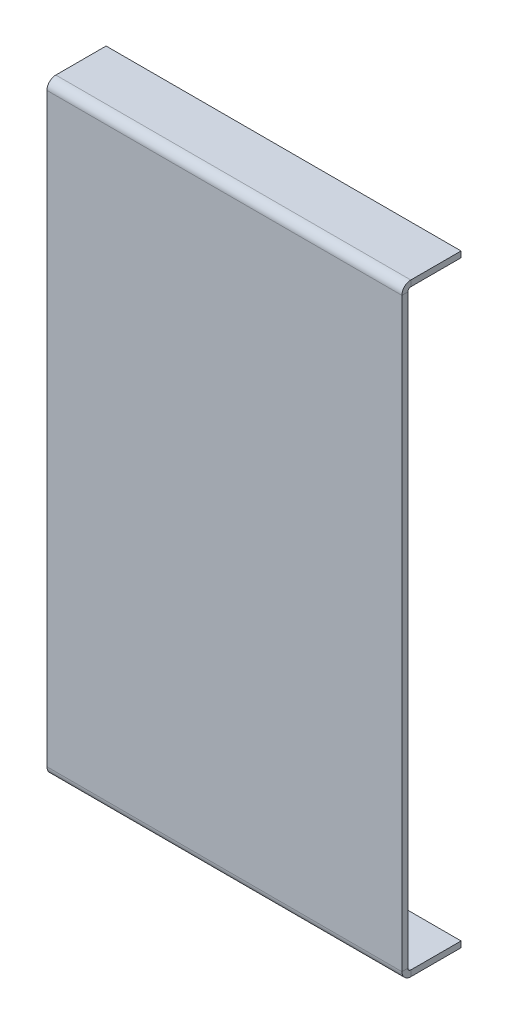
ISO-10303-21;
HEADER;
FILE_DESCRIPTION(('STEP AP214'),'2;1');
FILE_NAME('part.step','',(''),(''),'','','');
FILE_SCHEMA(('AUTOMOTIVE_DESIGN { 1 0 10303 214 1 1 1 1 }'));
ENDSEC;
DATA;
#1=APPLICATION_CONTEXT('core data for automotive mechanical design processes');
#2=APPLICATION_PROTOCOL_DEFINITION('international standard','automotive_design',2000,#1);
#3=PRODUCT_CONTEXT('',#1,'mechanical');
#4=PRODUCT('Part','Part','',(#3));
#5=PRODUCT_RELATED_PRODUCT_CATEGORY('part','',(#4));
#6=PRODUCT_DEFINITION_FORMATION('','',#4);
#7=PRODUCT_DEFINITION_CONTEXT('part definition',#1,'design');
#8=PRODUCT_DEFINITION('design','',#6,#7);
#9=PRODUCT_DEFINITION_SHAPE('','',#8);
#10=(LENGTH_UNIT() NAMED_UNIT(*) SI_UNIT(.MILLI.,.METRE.));
#11=(NAMED_UNIT(*) PLANE_ANGLE_UNIT() SI_UNIT($,.RADIAN.));
#12=(NAMED_UNIT(*) SI_UNIT($,.STERADIAN.) SOLID_ANGLE_UNIT());
#13=UNCERTAINTY_MEASURE_WITH_UNIT(LENGTH_MEASURE(1.E-05),#10,'distance_accuracy_value','');
#14=(GEOMETRIC_REPRESENTATION_CONTEXT(3) GLOBAL_UNCERTAINTY_ASSIGNED_CONTEXT((#13)) GLOBAL_UNIT_ASSIGNED_CONTEXT((#10,
#11,#12)) REPRESENTATION_CONTEXT('',''));
#15=CARTESIAN_POINT('',(0.,0.,0.));
#16=DIRECTION('',(0.,0.,1.));
#17=DIRECTION('',(1.,0.,0.));
#18=AXIS2_PLACEMENT_3D('',#15,#16,#17);
#19=CARTESIAN_POINT('',(0.,0.,-2.));
#20=DIRECTION('',(0.,0.,1.));
#21=DIRECTION('',(1.,0.,0.));
#22=AXIS2_PLACEMENT_3D('',#19,#20,#21);
#23=PLANE('',#22);
#24=DIRECTION('',(-1.,0.,0.));
#25=VECTOR('',#24,1.);
#26=CARTESIAN_POINT('',(-60.,-99.,-2.00000000000001));
#27=LINE('',#26,#25);
#28=CARTESIAN_POINT('',(-60.,-99.,-2.00000000000001));
#29=VERTEX_POINT('',#28);
#30=CARTESIAN_POINT('',(60.,-99.,-2.00000000000001));
#31=VERTEX_POINT('',#30);
#32=EDGE_CURVE('E224',#29,#31,#27,.F.);
#33=ORIENTED_EDGE('',*,*,#32,.F.);
#34=DIRECTION('',(0.,-1.,0.));
#35=VECTOR('',#34,1.);
#36=CARTESIAN_POINT('',(-60.,102.,-2.));
#37=LINE('',#36,#35);
#38=CARTESIAN_POINT('',(-60.,99.,-2.00000000000001));
#39=VERTEX_POINT('',#38);
#40=EDGE_CURVE('E13',#39,#29,#37,.T.);
#41=ORIENTED_EDGE('',*,*,#40,.F.);
#42=DIRECTION('',(1.,0.,0.));
#43=VECTOR('',#42,1.);
#44=CARTESIAN_POINT('',(60.,99.,-2.00000000000001));
#45=LINE('',#44,#43);
#46=CARTESIAN_POINT('',(60.,99.,-2.00000000000001));
#47=VERTEX_POINT('',#46);
#48=EDGE_CURVE('E276',#47,#39,#45,.F.);
#49=ORIENTED_EDGE('',*,*,#48,.F.);
#50=DIRECTION('',(0.,1.,0.));
#51=VECTOR('',#50,1.);
#52=CARTESIAN_POINT('',(60.,102.,-2.));
#53=LINE('',#52,#51);
#54=EDGE_CURVE('E87',#31,#47,#53,.T.);
#55=ORIENTED_EDGE('',*,*,#54,.F.);
#56=EDGE_LOOP('',(#33,#41,#49,#55));
#57=FACE_BOUND('',#56,.T.);
#58=ADVANCED_FACE('F78',(#57),#23,.F.);
#59=CARTESIAN_POINT('',(0.,0.,0.));
#60=DIRECTION('',(0.,0.,1.));
#61=DIRECTION('',(1.,0.,0.));
#62=AXIS2_PLACEMENT_3D('',#59,#60,#61);
#63=PLANE('',#62);
#64=DIRECTION('',(0.,-1.,0.));
#65=VECTOR('',#64,1.);
#66=CARTESIAN_POINT('',(-60.,102.,0.));
#67=LINE('',#66,#65);
#68=CARTESIAN_POINT('',(-60.,99.,0.));
#69=VERTEX_POINT('',#68);
#70=CARTESIAN_POINT('',(-60.,-99.,0.));
#71=VERTEX_POINT('',#70);
#72=EDGE_CURVE('E82',#69,#71,#67,.T.);
#73=ORIENTED_EDGE('',*,*,#72,.T.);
#74=DIRECTION('',(-1.,0.,0.));
#75=VECTOR('',#74,1.);
#76=CARTESIAN_POINT('',(-60.,-99.,0.));
#77=LINE('',#76,#75);
#78=CARTESIAN_POINT('',(60.,-99.,0.));
#79=VERTEX_POINT('',#78);
#80=EDGE_CURVE('E213',#71,#79,#77,.F.);
#81=ORIENTED_EDGE('',*,*,#80,.T.);
#82=DIRECTION('',(0.,1.,0.));
#83=VECTOR('',#82,1.);
#84=CARTESIAN_POINT('',(60.,102.,0.));
#85=LINE('',#84,#83);
#86=CARTESIAN_POINT('',(60.,99.,0.));
#87=VERTEX_POINT('',#86);
#88=EDGE_CURVE('E282',#79,#87,#85,.T.);
#89=ORIENTED_EDGE('',*,*,#88,.T.);
#90=DIRECTION('',(1.,0.,0.));
#91=VECTOR('',#90,1.);
#92=CARTESIAN_POINT('',(60.,99.,0.));
#93=LINE('',#92,#91);
#94=EDGE_CURVE('E265',#87,#69,#93,.F.);
#95=ORIENTED_EDGE('',*,*,#94,.T.);
#96=EDGE_LOOP('',(#73,#81,#89,#95));
#97=FACE_BOUND('',#96,.T.);
#98=ADVANCED_FACE('F291',(#97),#63,.T.);
#99=CARTESIAN_POINT('',(-60.,102.,-2.));
#100=DIRECTION('',(-1.,0.,0.));
#101=DIRECTION('',(0.,-1.,0.));
#102=AXIS2_PLACEMENT_3D('',#99,#100,#101);
#103=PLANE('',#102);
#104=ORIENTED_EDGE('',*,*,#40,.T.);
#105=DIRECTION('',(0.,0.,1.));
#106=VECTOR('',#105,1.);
#107=CARTESIAN_POINT('',(-60.,-99.,-2.00000000000001));
#108=LINE('',#107,#106);
#109=EDGE_CURVE('E218',#29,#71,#108,.T.);
#110=ORIENTED_EDGE('',*,*,#109,.T.);
#111=ORIENTED_EDGE('',*,*,#72,.F.);
#112=DIRECTION('',(0.,0.,1.));
#113=VECTOR('',#112,1.);
#114=CARTESIAN_POINT('',(-60.,99.,-2.00000000000001));
#115=LINE('',#114,#113);
#116=EDGE_CURVE('E280',#39,#69,#115,.T.);
#117=ORIENTED_EDGE('',*,*,#116,.F.);
#118=EDGE_LOOP('',(#104,#110,#111,#117));
#119=FACE_BOUND('',#118,.T.);
#120=ADVANCED_FACE('F294',(#119),#103,.T.);
#121=CARTESIAN_POINT('',(60.,102.,-2.));
#122=DIRECTION('',(1.,0.,0.));
#123=DIRECTION('',(0.,1.,0.));
#124=AXIS2_PLACEMENT_3D('',#121,#122,#123);
#125=PLANE('',#124);
#126=DIRECTION('',(0.,0.,1.));
#127=VECTOR('',#126,1.);
#128=CARTESIAN_POINT('',(60.,-99.,-2.00000000000001));
#129=LINE('',#128,#127);
#130=EDGE_CURVE('E228',#31,#79,#129,.T.);
#131=ORIENTED_EDGE('',*,*,#130,.F.);
#132=ORIENTED_EDGE('',*,*,#54,.T.);
#133=DIRECTION('',(0.,0.,1.));
#134=VECTOR('',#133,1.);
#135=CARTESIAN_POINT('',(60.,99.,-2.00000000000001));
#136=LINE('',#135,#134);
#137=EDGE_CURVE('E270',#47,#87,#136,.T.);
#138=ORIENTED_EDGE('',*,*,#137,.T.);
#139=ORIENTED_EDGE('',*,*,#88,.F.);
#140=EDGE_LOOP('',(#131,#132,#138,#139));
#141=FACE_BOUND('',#140,.T.);
#142=ADVANCED_FACE('F80',(#141),#125,.T.);
#143=CARTESIAN_POINT('',(-60.,99.,-3.00000000000001));
#144=DIRECTION('',(-1.,0.,0.));
#145=DIRECTION('',(0.,0.,1.));
#146=AXIS2_PLACEMENT_3D('',#143,#144,#145);
#147=PLANE('',#146);
#148=DIRECTION('',(0.,1.,0.));
#149=VECTOR('',#148,1.);
#150=CARTESIAN_POINT('',(-60.,102.,-3.));
#151=LINE('',#150,#149);
#152=CARTESIAN_POINT('',(-60.,100.,-3.));
#153=VERTEX_POINT('',#152);
#154=CARTESIAN_POINT('',(-60.,102.,-2.99999999999999));
#155=VERTEX_POINT('',#154);
#156=EDGE_CURVE('E230',#153,#155,#151,.T.);
#157=ORIENTED_EDGE('',*,*,#156,.F.);
#158=CARTESIAN_POINT('',(-60.,99.,-3.00000000000001));
#159=DIRECTION('',(1.,0.,0.));
#160=DIRECTION('',(0.,0.,-1.));
#161=AXIS2_PLACEMENT_3D('',#158,#159,#160);
#162=CIRCLE('',#161,1.);
#163=EDGE_CURVE('E273',#39,#153,#162,.F.);
#164=ORIENTED_EDGE('',*,*,#163,.F.);
#165=ORIENTED_EDGE('',*,*,#116,.T.);
#166=CARTESIAN_POINT('',(-60.,99.,-3.00000000000001));
#167=DIRECTION('',(1.,0.,0.));
#168=DIRECTION('',(0.,0.,-1.));
#169=AXIS2_PLACEMENT_3D('',#166,#167,#168);
#170=CIRCLE('',#169,3.);
#171=EDGE_CURVE('E95',#69,#155,#170,.F.);
#172=ORIENTED_EDGE('',*,*,#171,.T.);
#173=EDGE_LOOP('',(#157,#164,#165,#172));
#174=FACE_BOUND('',#173,.T.);
#175=ADVANCED_FACE('F340',(#174),#147,.T.);
#176=CARTESIAN_POINT('',(60.,99.,-3.00000000000001));
#177=DIRECTION('',(-1.,0.,0.));
#178=DIRECTION('',(0.,0.,1.));
#179=AXIS2_PLACEMENT_3D('',#176,#177,#178);
#180=PLANE('',#179);
#181=CARTESIAN_POINT('',(60.,99.,-3.00000000000001));
#182=DIRECTION('',(1.,0.,0.));
#183=DIRECTION('',(0.,0.,-1.));
#184=AXIS2_PLACEMENT_3D('',#181,#182,#183);
#185=CIRCLE('',#184,1.);
#186=CARTESIAN_POINT('',(60.,100.,-3.));
#187=VERTEX_POINT('',#186);
#188=EDGE_CURVE('E235',#187,#47,#185,.T.);
#189=ORIENTED_EDGE('',*,*,#188,.F.);
#190=DIRECTION('',(0.,1.,0.));
#191=VECTOR('',#190,1.);
#192=CARTESIAN_POINT('',(60.,100.,-3.));
#193=LINE('',#192,#191);
#194=CARTESIAN_POINT('',(60.,102.,-2.99999999999999));
#195=VERTEX_POINT('',#194);
#196=EDGE_CURVE('E258',#187,#195,#193,.T.);
#197=ORIENTED_EDGE('',*,*,#196,.T.);
#198=CARTESIAN_POINT('',(60.,99.,-3.00000000000001));
#199=DIRECTION('',(1.,0.,0.));
#200=DIRECTION('',(0.,0.,-1.));
#201=AXIS2_PLACEMENT_3D('',#198,#199,#200);
#202=CIRCLE('',#201,3.);
#203=EDGE_CURVE('E268',#195,#87,#202,.T.);
#204=ORIENTED_EDGE('',*,*,#203,.T.);
#205=ORIENTED_EDGE('',*,*,#137,.F.);
#206=EDGE_LOOP('',(#189,#197,#204,#205));
#207=FACE_BOUND('',#206,.T.);
#208=ADVANCED_FACE('F334',(#207),#180,.F.);
#209=CARTESIAN_POINT('',(60.,99.,-3.00000000000001));
#210=DIRECTION('',(1.,0.,0.));
#211=DIRECTION('',(0.,1.,0.));
#212=AXIS2_PLACEMENT_3D('',#209,#210,#211);
#213=CYLINDRICAL_SURFACE('',#212,3.);
#214=ORIENTED_EDGE('',*,*,#94,.F.);
#215=ORIENTED_EDGE('',*,*,#203,.F.);
#216=DIRECTION('',(1.,0.,0.));
#217=VECTOR('',#216,1.);
#218=CARTESIAN_POINT('',(0.,102.,-2.99999999999999));
#219=LINE('',#218,#217);
#220=EDGE_CURVE('E255',#155,#195,#219,.T.);
#221=ORIENTED_EDGE('',*,*,#220,.F.);
#222=ORIENTED_EDGE('',*,*,#171,.F.);
#223=EDGE_LOOP('',(#214,#215,#221,#222));
#224=FACE_BOUND('',#223,.T.);
#225=ADVANCED_FACE('F348',(#224),#213,.T.);
#226=CARTESIAN_POINT('',(60.,99.,-3.00000000000001));
#227=DIRECTION('',(1.,0.,0.));
#228=DIRECTION('',(0.,1.,0.));
#229=AXIS2_PLACEMENT_3D('',#226,#227,#228);
#230=CYLINDRICAL_SURFACE('',#229,1.);
#231=ORIENTED_EDGE('',*,*,#48,.T.);
#232=ORIENTED_EDGE('',*,*,#163,.T.);
#233=DIRECTION('',(-1.,0.,0.));
#234=VECTOR('',#233,1.);
#235=CARTESIAN_POINT('',(-60.,100.,-3.));
#236=LINE('',#235,#234);
#237=EDGE_CURVE('E261',#153,#187,#236,.F.);
#238=ORIENTED_EDGE('',*,*,#237,.T.);
#239=ORIENTED_EDGE('',*,*,#188,.T.);
#240=EDGE_LOOP('',(#231,#232,#238,#239));
#241=FACE_BOUND('',#240,.T.);
#242=ADVANCED_FACE('F351',(#241),#230,.F.);
#243=CARTESIAN_POINT('',(60.,102.,-1.99999999999999));
#244=DIRECTION('',(1.,0.,0.));
#245=DIRECTION('',(0.,0.,-1.));
#246=AXIS2_PLACEMENT_3D('',#243,#244,#245);
#247=PLANE('',#246);
#248=DIRECTION('',(0.,0.,1.));
#249=VECTOR('',#248,1.);
#250=CARTESIAN_POINT('',(60.,102.,-1.99999999999999));
#251=LINE('',#250,#249);
#252=CARTESIAN_POINT('',(60.,102.,-20.));
#253=VERTEX_POINT('',#252);
#254=EDGE_CURVE('E239',#253,#195,#251,.T.);
#255=ORIENTED_EDGE('',*,*,#254,.T.);
#256=ORIENTED_EDGE('',*,*,#196,.F.);
#257=DIRECTION('',(0.,0.,-1.));
#258=VECTOR('',#257,1.);
#259=CARTESIAN_POINT('',(60.,100.,4.62592926927148E-13));
#260=LINE('',#259,#258);
#261=CARTESIAN_POINT('',(60.,100.,-20.));
#262=VERTEX_POINT('',#261);
#263=EDGE_CURVE('E247',#262,#187,#260,.F.);
#264=ORIENTED_EDGE('',*,*,#263,.F.);
#265=DIRECTION('',(0.,-1.,0.));
#266=VECTOR('',#265,1.);
#267=CARTESIAN_POINT('',(60.,102.,-20.));
#268=LINE('',#267,#266);
#269=EDGE_CURVE('E233',#253,#262,#268,.T.);
#270=ORIENTED_EDGE('',*,*,#269,.F.);
#271=EDGE_LOOP('',(#255,#256,#264,#270));
#272=FACE_BOUND('',#271,.T.);
#273=ADVANCED_FACE('F354',(#272),#247,.T.);
#274=CARTESIAN_POINT('',(-60.,102.,-20.));
#275=DIRECTION('',(-1.,0.,0.));
#276=DIRECTION('',(0.,0.,1.));
#277=AXIS2_PLACEMENT_3D('',#274,#275,#276);
#278=PLANE('',#277);
#279=DIRECTION('',(0.,0.,1.));
#280=VECTOR('',#279,1.);
#281=CARTESIAN_POINT('',(-60.,100.,3.23815048849004E-13));
#282=LINE('',#281,#280);
#283=CARTESIAN_POINT('',(-60.,100.,-20.));
#284=VERTEX_POINT('',#283);
#285=EDGE_CURVE('E253',#153,#284,#282,.F.);
#286=ORIENTED_EDGE('',*,*,#285,.F.);
#287=ORIENTED_EDGE('',*,*,#156,.T.);
#288=DIRECTION('',(0.,0.,-1.));
#289=VECTOR('',#288,1.);
#290=CARTESIAN_POINT('',(-60.,102.,-20.));
#291=LINE('',#290,#289);
#292=CARTESIAN_POINT('',(-60.,102.,-20.));
#293=VERTEX_POINT('',#292);
#294=EDGE_CURVE('E245',#155,#293,#291,.T.);
#295=ORIENTED_EDGE('',*,*,#294,.T.);
#296=DIRECTION('',(0.,-1.,0.));
#297=VECTOR('',#296,1.);
#298=CARTESIAN_POINT('',(-60.,102.,-20.));
#299=LINE('',#298,#297);
#300=EDGE_CURVE('E236',#293,#284,#299,.T.);
#301=ORIENTED_EDGE('',*,*,#300,.T.);
#302=EDGE_LOOP('',(#286,#287,#295,#301));
#303=FACE_BOUND('',#302,.T.);
#304=ADVANCED_FACE('F358',(#303),#278,.T.);
#305=CARTESIAN_POINT('',(0.,102.,4.00186950565762E-13));
#306=DIRECTION('',(0.,1.,0.));
#307=DIRECTION('',(0.,0.,1.));
#308=AXIS2_PLACEMENT_3D('',#305,#306,#307);
#309=PLANE('',#308);
#310=ORIENTED_EDGE('',*,*,#294,.F.);
#311=ORIENTED_EDGE('',*,*,#220,.T.);
#312=ORIENTED_EDGE('',*,*,#254,.F.);
#313=DIRECTION('',(1.,0.,0.));
#314=VECTOR('',#313,1.);
#315=CARTESIAN_POINT('',(60.,102.,-20.));
#316=LINE('',#315,#314);
#317=EDGE_CURVE('E242',#293,#253,#316,.T.);
#318=ORIENTED_EDGE('',*,*,#317,.F.);
#319=EDGE_LOOP('',(#310,#311,#312,#318));
#320=FACE_BOUND('',#319,.T.);
#321=ADVANCED_FACE('F361',(#320),#309,.T.);
#322=CARTESIAN_POINT('',(0.,100.,3.93203987888076E-13));
#323=DIRECTION('',(0.,1.,0.));
#324=DIRECTION('',(0.,0.,1.));
#325=AXIS2_PLACEMENT_3D('',#322,#323,#324);
#326=PLANE('',#325);
#327=ORIENTED_EDGE('',*,*,#237,.F.);
#328=ORIENTED_EDGE('',*,*,#285,.T.);
#329=DIRECTION('',(-1.,0.,0.));
#330=VECTOR('',#329,1.);
#331=CARTESIAN_POINT('',(0.,100.,-20.));
#332=LINE('',#331,#330);
#333=EDGE_CURVE('E250',#284,#262,#332,.F.);
#334=ORIENTED_EDGE('',*,*,#333,.T.);
#335=ORIENTED_EDGE('',*,*,#263,.T.);
#336=EDGE_LOOP('',(#327,#328,#334,#335));
#337=FACE_BOUND('',#336,.T.);
#338=ADVANCED_FACE('F366',(#337),#326,.F.);
#339=CARTESIAN_POINT('',(60.,102.,-20.));
#340=DIRECTION('',(0.,0.,-1.));
#341=DIRECTION('',(0.,1.,0.));
#342=AXIS2_PLACEMENT_3D('',#339,#340,#341);
#343=PLANE('',#342);
#344=ORIENTED_EDGE('',*,*,#333,.F.);
#345=ORIENTED_EDGE('',*,*,#300,.F.);
#346=ORIENTED_EDGE('',*,*,#317,.T.);
#347=ORIENTED_EDGE('',*,*,#269,.T.);
#348=EDGE_LOOP('',(#344,#345,#346,#347));
#349=FACE_BOUND('',#348,.T.);
#350=ADVANCED_FACE('F363',(#349),#343,.T.);
#351=CARTESIAN_POINT('',(60.,-99.,-3.00000000000001));
#352=DIRECTION('',(1.,0.,0.));
#353=DIRECTION('',(0.,0.,-1.));
#354=AXIS2_PLACEMENT_3D('',#351,#352,#353);
#355=PLANE('',#354);
#356=DIRECTION('',(0.,-1.,0.));
#357=VECTOR('',#356,1.);
#358=CARTESIAN_POINT('',(60.,-102.,-2.99999999999999));
#359=LINE('',#358,#357);
#360=CARTESIAN_POINT('',(60.,-100.,-3.));
#361=VERTEX_POINT('',#360);
#362=CARTESIAN_POINT('',(60.,-102.,-2.99999999999999));
#363=VERTEX_POINT('',#362);
#364=EDGE_CURVE('E210',#361,#363,#359,.T.);
#365=ORIENTED_EDGE('',*,*,#364,.F.);
#366=CARTESIAN_POINT('',(60.,-99.,-3.00000000000001));
#367=DIRECTION('',(-1.,0.,0.));
#368=DIRECTION('',(0.,0.,1.));
#369=AXIS2_PLACEMENT_3D('',#366,#367,#368);
#370=CIRCLE('',#369,1.);
#371=EDGE_CURVE('E221',#31,#361,#370,.F.);
#372=ORIENTED_EDGE('',*,*,#371,.F.);
#373=ORIENTED_EDGE('',*,*,#130,.T.);
#374=CARTESIAN_POINT('',(60.,-99.,-3.00000000000001));
#375=DIRECTION('',(-1.,0.,0.));
#376=DIRECTION('',(0.,0.,1.));
#377=AXIS2_PLACEMENT_3D('',#374,#375,#376);
#378=CIRCLE('',#377,3.);
#379=EDGE_CURVE('E103',#79,#363,#378,.F.);
#380=ORIENTED_EDGE('',*,*,#379,.T.);
#381=EDGE_LOOP('',(#365,#372,#373,#380));
#382=FACE_BOUND('',#381,.T.);
#383=ADVANCED_FACE('F310',(#382),#355,.T.);
#384=CARTESIAN_POINT('',(-60.,-99.,-3.00000000000001));
#385=DIRECTION('',(1.,0.,0.));
#386=DIRECTION('',(0.,0.,-1.));
#387=AXIS2_PLACEMENT_3D('',#384,#385,#386);
#388=PLANE('',#387);
#389=CARTESIAN_POINT('',(-60.,-99.,-3.00000000000001));
#390=DIRECTION('',(-1.,0.,0.));
#391=DIRECTION('',(0.,0.,1.));
#392=AXIS2_PLACEMENT_3D('',#389,#390,#391);
#393=CIRCLE('',#392,1.);
#394=CARTESIAN_POINT('',(-60.,-100.,-3.));
#395=VERTEX_POINT('',#394);
#396=EDGE_CURVE('E180',#395,#29,#393,.T.);
#397=ORIENTED_EDGE('',*,*,#396,.F.);
#398=DIRECTION('',(0.,-1.,0.));
#399=VECTOR('',#398,1.);
#400=CARTESIAN_POINT('',(-60.,-100.,-3.));
#401=LINE('',#400,#399);
#402=CARTESIAN_POINT('',(-60.,-102.,-2.99999999999999));
#403=VERTEX_POINT('',#402);
#404=EDGE_CURVE('E205',#395,#403,#401,.T.);
#405=ORIENTED_EDGE('',*,*,#404,.T.);
#406=CARTESIAN_POINT('',(-60.,-99.,-3.00000000000001));
#407=DIRECTION('',(-1.,0.,0.));
#408=DIRECTION('',(0.,0.,1.));
#409=AXIS2_PLACEMENT_3D('',#406,#407,#408);
#410=CIRCLE('',#409,3.);
#411=EDGE_CURVE('E216',#403,#71,#410,.T.);
#412=ORIENTED_EDGE('',*,*,#411,.T.);
#413=ORIENTED_EDGE('',*,*,#109,.F.);
#414=EDGE_LOOP('',(#397,#405,#412,#413));
#415=FACE_BOUND('',#414,.T.);
#416=ADVANCED_FACE('F298',(#415),#388,.F.);
#417=CARTESIAN_POINT('',(-60.,-99.,-3.00000000000001));
#418=DIRECTION('',(-1.,0.,0.));
#419=DIRECTION('',(0.,-1.,0.));
#420=AXIS2_PLACEMENT_3D('',#417,#418,#419);
#421=CYLINDRICAL_SURFACE('',#420,3.);
#422=ORIENTED_EDGE('',*,*,#80,.F.);
#423=ORIENTED_EDGE('',*,*,#411,.F.);
#424=DIRECTION('',(-1.,0.,0.));
#425=VECTOR('',#424,1.);
#426=CARTESIAN_POINT('',(60.,-102.,-2.99999999999999));
#427=LINE('',#426,#425);
#428=EDGE_CURVE('E189',#403,#363,#427,.F.);
#429=ORIENTED_EDGE('',*,*,#428,.T.);
#430=ORIENTED_EDGE('',*,*,#379,.F.);
#431=EDGE_LOOP('',(#422,#423,#429,#430));
#432=FACE_BOUND('',#431,.T.);
#433=ADVANCED_FACE('F323',(#432),#421,.T.);
#434=CARTESIAN_POINT('',(-60.,-99.,-3.00000000000001));
#435=DIRECTION('',(-1.,0.,0.));
#436=DIRECTION('',(0.,-1.,0.));
#437=AXIS2_PLACEMENT_3D('',#434,#435,#436);
#438=CYLINDRICAL_SURFACE('',#437,1.);
#439=ORIENTED_EDGE('',*,*,#32,.T.);
#440=ORIENTED_EDGE('',*,*,#371,.T.);
#441=DIRECTION('',(-1.,0.,0.));
#442=VECTOR('',#441,1.);
#443=CARTESIAN_POINT('',(60.,-100.,-3.));
#444=LINE('',#443,#442);
#445=EDGE_CURVE('E208',#361,#395,#444,.T.);
#446=ORIENTED_EDGE('',*,*,#445,.T.);
#447=ORIENTED_EDGE('',*,*,#396,.T.);
#448=EDGE_LOOP('',(#439,#440,#446,#447));
#449=FACE_BOUND('',#448,.T.);
#450=ADVANCED_FACE('F301',(#449),#438,.F.);
#451=CARTESIAN_POINT('',(60.,-102.,-1.99999999999999));
#452=DIRECTION('',(1.,0.,0.));
#453=DIRECTION('',(0.,0.,-1.));
#454=AXIS2_PLACEMENT_3D('',#451,#452,#453);
#455=PLANE('',#454);
#456=DIRECTION('',(0.,0.,-1.));
#457=VECTOR('',#456,1.);
#458=CARTESIAN_POINT('',(60.,-100.,4.62592926927148E-13));
#459=LINE('',#458,#457);
#460=CARTESIAN_POINT('',(60.,-100.,-20.));
#461=VERTEX_POINT('',#460);
#462=EDGE_CURVE('E202',#361,#461,#459,.T.);
#463=ORIENTED_EDGE('',*,*,#462,.F.);
#464=ORIENTED_EDGE('',*,*,#364,.T.);
#465=DIRECTION('',(0.,0.,1.));
#466=VECTOR('',#465,1.);
#467=CARTESIAN_POINT('',(60.,-102.,-1.99999999999999));
#468=LINE('',#467,#466);
#469=CARTESIAN_POINT('',(60.,-102.,-20.));
#470=VERTEX_POINT('',#469);
#471=EDGE_CURVE('E194',#363,#470,#468,.F.);
#472=ORIENTED_EDGE('',*,*,#471,.T.);
#473=DIRECTION('',(0.,1.,0.));
#474=VECTOR('',#473,1.);
#475=CARTESIAN_POINT('',(60.,-102.,-20.));
#476=LINE('',#475,#474);
#477=EDGE_CURVE('E181',#470,#461,#476,.T.);
#478=ORIENTED_EDGE('',*,*,#477,.T.);
#479=EDGE_LOOP('',(#463,#464,#472,#478));
#480=FACE_BOUND('',#479,.T.);
#481=ADVANCED_FACE('F315',(#480),#455,.T.);
#482=CARTESIAN_POINT('',(-60.,-102.,-20.));
#483=DIRECTION('',(-1.,0.,0.));
#484=DIRECTION('',(0.,0.,1.));
#485=AXIS2_PLACEMENT_3D('',#482,#483,#484);
#486=PLANE('',#485);
#487=DIRECTION('',(0.,0.,-1.));
#488=VECTOR('',#487,1.);
#489=CARTESIAN_POINT('',(-60.,-102.,-20.));
#490=LINE('',#489,#488);
#491=CARTESIAN_POINT('',(-60.,-102.,-20.));
#492=VERTEX_POINT('',#491);
#493=EDGE_CURVE('E173',#492,#403,#490,.F.);
#494=ORIENTED_EDGE('',*,*,#493,.T.);
#495=ORIENTED_EDGE('',*,*,#404,.F.);
#496=DIRECTION('',(0.,0.,1.));
#497=VECTOR('',#496,1.);
#498=CARTESIAN_POINT('',(-60.,-100.,3.23815048849004E-13));
#499=LINE('',#498,#497);
#500=CARTESIAN_POINT('',(-60.,-100.,-20.));
#501=VERTEX_POINT('',#500);
#502=EDGE_CURVE('E175',#501,#395,#499,.T.);
#503=ORIENTED_EDGE('',*,*,#502,.F.);
#504=DIRECTION('',(0.,1.,0.));
#505=VECTOR('',#504,1.);
#506=CARTESIAN_POINT('',(-60.,-102.,-20.));
#507=LINE('',#506,#505);
#508=EDGE_CURVE('E169',#492,#501,#507,.T.);
#509=ORIENTED_EDGE('',*,*,#508,.F.);
#510=EDGE_LOOP('',(#494,#495,#503,#509));
#511=FACE_BOUND('',#510,.T.);
#512=ADVANCED_FACE('F171',(#511),#486,.T.);
#513=CARTESIAN_POINT('',(0.,-102.,4.00186950565762E-13));
#514=DIRECTION('',(0.,1.,0.));
#515=DIRECTION('',(0.,0.,1.));
#516=AXIS2_PLACEMENT_3D('',#513,#514,#515);
#517=PLANE('',#516);
#518=ORIENTED_EDGE('',*,*,#428,.F.);
#519=ORIENTED_EDGE('',*,*,#493,.F.);
#520=DIRECTION('',(1.,0.,0.));
#521=VECTOR('',#520,1.);
#522=CARTESIAN_POINT('',(60.,-102.,-20.));
#523=LINE('',#522,#521);
#524=EDGE_CURVE('E188',#470,#492,#523,.F.);
#525=ORIENTED_EDGE('',*,*,#524,.F.);
#526=ORIENTED_EDGE('',*,*,#471,.F.);
#527=EDGE_LOOP('',(#518,#519,#525,#526));
#528=FACE_BOUND('',#527,.T.);
#529=ADVANCED_FACE('F186',(#528),#517,.F.);
#530=CARTESIAN_POINT('',(0.,-100.,3.93203987888076E-13));
#531=DIRECTION('',(0.,1.,0.));
#532=DIRECTION('',(0.,0.,1.));
#533=AXIS2_PLACEMENT_3D('',#530,#531,#532);
#534=PLANE('',#533);
#535=ORIENTED_EDGE('',*,*,#502,.T.);
#536=ORIENTED_EDGE('',*,*,#445,.F.);
#537=ORIENTED_EDGE('',*,*,#462,.T.);
#538=DIRECTION('',(-1.,0.,0.));
#539=VECTOR('',#538,1.);
#540=CARTESIAN_POINT('',(0.,-100.,-20.));
#541=LINE('',#540,#539);
#542=EDGE_CURVE('E200',#461,#501,#541,.T.);
#543=ORIENTED_EDGE('',*,*,#542,.T.);
#544=EDGE_LOOP('',(#535,#536,#537,#543));
#545=FACE_BOUND('',#544,.T.);
#546=ADVANCED_FACE('F313',(#545),#534,.T.);
#547=CARTESIAN_POINT('',(60.,-102.,-20.));
#548=DIRECTION('',(0.,0.,-1.));
#549=DIRECTION('',(0.,1.,0.));
#550=AXIS2_PLACEMENT_3D('',#547,#548,#549);
#551=PLANE('',#550);
#552=ORIENTED_EDGE('',*,*,#542,.F.);
#553=ORIENTED_EDGE('',*,*,#477,.F.);
#554=ORIENTED_EDGE('',*,*,#524,.T.);
#555=ORIENTED_EDGE('',*,*,#508,.T.);
#556=EDGE_LOOP('',(#552,#553,#554,#555));
#557=FACE_BOUND('',#556,.T.);
#558=ADVANCED_FACE('F192',(#557),#551,.T.);
#559=CLOSED_SHELL('',(#58,#98,#120,#142,#175,#208,#225,#242,#273,#304,#321,#338,#350,#383,#416,
#433,#450,#481,#512,#529,#546,#558));
#560=MANIFOLD_SOLID_BREP('B2',#559);
#561=ADVANCED_BREP_SHAPE_REPRESENTATION('',(#18,#560),#14);
#562=SHAPE_DEFINITION_REPRESENTATION(#9,#561);
ENDSEC;
END-ISO-10303-21;
